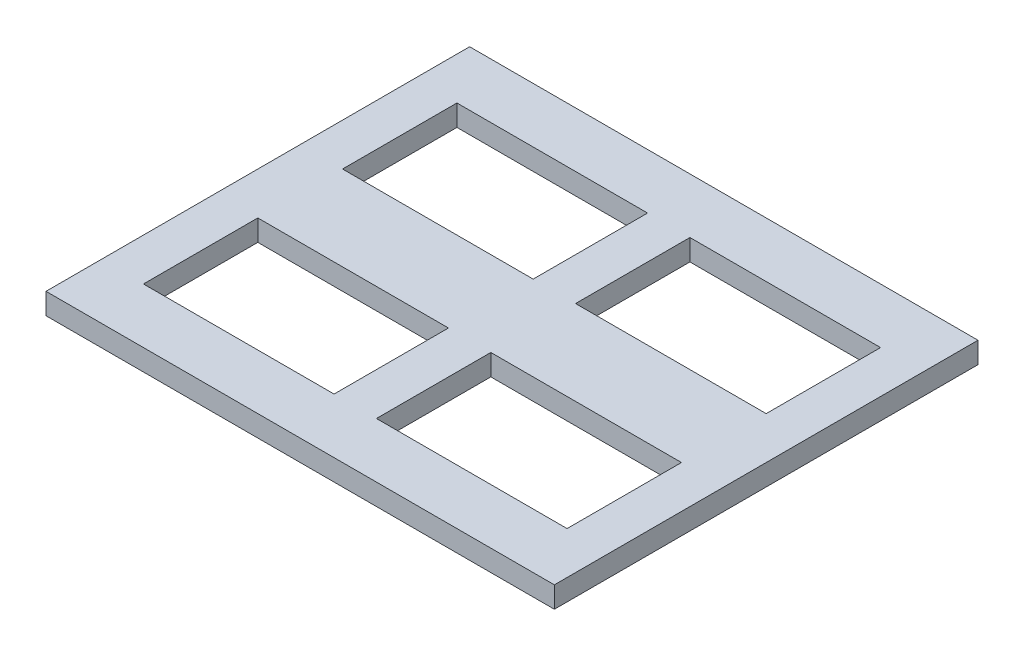
ISO-10303-21;
HEADER;
FILE_DESCRIPTION(('STEP AP214'),'2;1');
FILE_NAME('part.step','',(''),(''),'','','');
FILE_SCHEMA(('AUTOMOTIVE_DESIGN { 1 0 10303 214 1 1 1 1 }'));
ENDSEC;
DATA;
#1=APPLICATION_CONTEXT('core data for automotive mechanical design processes');
#2=APPLICATION_PROTOCOL_DEFINITION('international standard','automotive_design',2000,#1);
#3=PRODUCT_CONTEXT('',#1,'mechanical');
#4=PRODUCT('Part','Part','',(#3));
#5=PRODUCT_RELATED_PRODUCT_CATEGORY('part','',(#4));
#6=PRODUCT_DEFINITION_FORMATION('','',#4);
#7=PRODUCT_DEFINITION_CONTEXT('part definition',#1,'design');
#8=PRODUCT_DEFINITION('design','',#6,#7);
#9=PRODUCT_DEFINITION_SHAPE('','',#8);
#10=(LENGTH_UNIT() NAMED_UNIT(*) SI_UNIT(.MILLI.,.METRE.));
#11=(NAMED_UNIT(*) PLANE_ANGLE_UNIT() SI_UNIT($,.RADIAN.));
#12=(NAMED_UNIT(*) SI_UNIT($,.STERADIAN.) SOLID_ANGLE_UNIT());
#13=UNCERTAINTY_MEASURE_WITH_UNIT(LENGTH_MEASURE(1.E-05),#10,'distance_accuracy_value','');
#14=(GEOMETRIC_REPRESENTATION_CONTEXT(3) GLOBAL_UNCERTAINTY_ASSIGNED_CONTEXT((#13)) GLOBAL_UNIT_ASSIGNED_CONTEXT((#10,
#11,#12)) REPRESENTATION_CONTEXT('',''));
#15=CARTESIAN_POINT('',(0.,0.,0.));
#16=DIRECTION('',(0.,0.,1.));
#17=DIRECTION('',(1.,0.,0.));
#18=AXIS2_PLACEMENT_3D('',#15,#16,#17);
#19=CARTESIAN_POINT('',(0.,5.,0.));
#20=DIRECTION('',(0.,1.,0.));
#21=DIRECTION('',(0.,0.,1.));
#22=AXIS2_PLACEMENT_3D('',#19,#20,#21);
#23=PLANE('',#22);
#24=DIRECTION('',(0.,0.,1.));
#25=VECTOR('',#24,1.);
#26=CARTESIAN_POINT('',(-60.,5.,-50.));
#27=LINE('',#26,#25);
#28=CARTESIAN_POINT('',(-60.,5.,-50.));
#29=VERTEX_POINT('',#28);
#30=CARTESIAN_POINT('',(-60.,5.,50.));
#31=VERTEX_POINT('',#30);
#32=EDGE_CURVE('E299',#29,#31,#27,.T.);
#33=ORIENTED_EDGE('',*,*,#32,.T.);
#34=DIRECTION('',(1.,0.,0.));
#35=VECTOR('',#34,1.);
#36=CARTESIAN_POINT('',(-60.,5.,50.));
#37=LINE('',#36,#35);
#38=CARTESIAN_POINT('',(60.,5.,50.));
#39=VERTEX_POINT('',#38);
#40=EDGE_CURVE('E302',#31,#39,#37,.T.);
#41=ORIENTED_EDGE('',*,*,#40,.T.);
#42=DIRECTION('',(0.,0.,-1.));
#43=VECTOR('',#42,1.);
#44=CARTESIAN_POINT('',(60.,5.,-50.));
#45=LINE('',#44,#43);
#46=CARTESIAN_POINT('',(60.,5.,-50.));
#47=VERTEX_POINT('',#46);
#48=EDGE_CURVE('E305',#39,#47,#45,.T.);
#49=ORIENTED_EDGE('',*,*,#48,.T.);
#50=DIRECTION('',(-1.,0.,0.));
#51=VECTOR('',#50,1.);
#52=CARTESIAN_POINT('',(-60.,5.,-50.));
#53=LINE('',#52,#51);
#54=EDGE_CURVE('E307',#47,#29,#53,.T.);
#55=ORIENTED_EDGE('',*,*,#54,.T.);
#56=EDGE_LOOP('',(#33,#41,#49,#55));
#57=FACE_BOUND('',#56,.T.);
#58=DIRECTION('',(1.,0.,0.));
#59=VECTOR('',#58,1.);
#60=CARTESIAN_POINT('',(-50.,5.,-10.));
#61=LINE('',#60,#59);
#62=CARTESIAN_POINT('',(-50.,5.,-10.));
#63=VERTEX_POINT('',#62);
#64=CARTESIAN_POINT('',(-5.,5.,-10.));
#65=VERTEX_POINT('',#64);
#66=EDGE_CURVE('E270',#63,#65,#61,.T.);
#67=ORIENTED_EDGE('',*,*,#66,.F.);
#68=DIRECTION('',(0.,0.,1.));
#69=VECTOR('',#68,1.);
#70=CARTESIAN_POINT('',(-50.,5.,-37.));
#71=LINE('',#70,#69);
#72=CARTESIAN_POINT('',(-50.,5.,-37.));
#73=VERTEX_POINT('',#72);
#74=EDGE_CURVE('E268',#73,#63,#71,.T.);
#75=ORIENTED_EDGE('',*,*,#74,.F.);
#76=DIRECTION('',(-1.,0.,0.));
#77=VECTOR('',#76,1.);
#78=CARTESIAN_POINT('',(-50.,5.,-37.));
#79=LINE('',#78,#77);
#80=CARTESIAN_POINT('',(-5.,5.,-37.));
#81=VERTEX_POINT('',#80);
#82=EDGE_CURVE('E276',#81,#73,#79,.T.);
#83=ORIENTED_EDGE('',*,*,#82,.F.);
#84=DIRECTION('',(0.,0.,-1.));
#85=VECTOR('',#84,1.);
#86=CARTESIAN_POINT('',(-5.,5.,-37.));
#87=LINE('',#86,#85);
#88=EDGE_CURVE('E273',#65,#81,#87,.T.);
#89=ORIENTED_EDGE('',*,*,#88,.F.);
#90=EDGE_LOOP('',(#67,#75,#83,#89));
#91=FACE_BOUND('',#90,.T.);
#92=DIRECTION('',(1.,0.,0.));
#93=VECTOR('',#92,1.);
#94=CARTESIAN_POINT('',(-50.,5.,37.));
#95=LINE('',#94,#93);
#96=CARTESIAN_POINT('',(-50.,5.,37.));
#97=VERTEX_POINT('',#96);
#98=CARTESIAN_POINT('',(-4.99999999999998,5.,37.));
#99=VERTEX_POINT('',#98);
#100=EDGE_CURVE('E239',#97,#99,#95,.T.);
#101=ORIENTED_EDGE('',*,*,#100,.F.);
#102=DIRECTION('',(0.,0.,1.));
#103=VECTOR('',#102,1.);
#104=CARTESIAN_POINT('',(-50.,5.,37.));
#105=LINE('',#104,#103);
#106=CARTESIAN_POINT('',(-50.,5.,10.));
#107=VERTEX_POINT('',#106);
#108=EDGE_CURVE('E237',#107,#97,#105,.T.);
#109=ORIENTED_EDGE('',*,*,#108,.F.);
#110=DIRECTION('',(-1.,0.,0.));
#111=VECTOR('',#110,1.);
#112=CARTESIAN_POINT('',(-50.,5.,10.));
#113=LINE('',#112,#111);
#114=CARTESIAN_POINT('',(-5.,5.,10.));
#115=VERTEX_POINT('',#114);
#116=EDGE_CURVE('E245',#115,#107,#113,.T.);
#117=ORIENTED_EDGE('',*,*,#116,.F.);
#118=DIRECTION('',(0.,0.,-1.));
#119=VECTOR('',#118,1.);
#120=CARTESIAN_POINT('',(-4.99999999999998,5.,37.));
#121=LINE('',#120,#119);
#122=EDGE_CURVE('E242',#99,#115,#121,.T.);
#123=ORIENTED_EDGE('',*,*,#122,.F.);
#124=EDGE_LOOP('',(#101,#109,#117,#123));
#125=FACE_BOUND('',#124,.T.);
#126=DIRECTION('',(-1.,0.,0.));
#127=VECTOR('',#126,1.);
#128=CARTESIAN_POINT('',(50.,5.,-37.));
#129=LINE('',#128,#127);
#130=CARTESIAN_POINT('',(50.,5.,-37.));
#131=VERTEX_POINT('',#130);
#132=CARTESIAN_POINT('',(5.00000000000001,5.,-37.));
#133=VERTEX_POINT('',#132);
#134=EDGE_CURVE('E208',#131,#133,#129,.T.);
#135=ORIENTED_EDGE('',*,*,#134,.F.);
#136=DIRECTION('',(0.,0.,-1.));
#137=VECTOR('',#136,1.);
#138=CARTESIAN_POINT('',(50.,5.,-37.));
#139=LINE('',#138,#137);
#140=CARTESIAN_POINT('',(50.,5.,-10.));
#141=VERTEX_POINT('',#140);
#142=EDGE_CURVE('E206',#141,#131,#139,.T.);
#143=ORIENTED_EDGE('',*,*,#142,.F.);
#144=DIRECTION('',(1.,0.,0.));
#145=VECTOR('',#144,1.);
#146=CARTESIAN_POINT('',(50.,5.,-10.));
#147=LINE('',#146,#145);
#148=CARTESIAN_POINT('',(5.,5.,-10.));
#149=VERTEX_POINT('',#148);
#150=EDGE_CURVE('E214',#149,#141,#147,.T.);
#151=ORIENTED_EDGE('',*,*,#150,.F.);
#152=DIRECTION('',(0.,0.,1.));
#153=VECTOR('',#152,1.);
#154=CARTESIAN_POINT('',(5.00000000000001,5.,-37.));
#155=LINE('',#154,#153);
#156=EDGE_CURVE('E211',#133,#149,#155,.T.);
#157=ORIENTED_EDGE('',*,*,#156,.F.);
#158=EDGE_LOOP('',(#135,#143,#151,#157));
#159=FACE_BOUND('',#158,.T.);
#160=DIRECTION('',(-1.,0.,0.));
#161=VECTOR('',#160,1.);
#162=CARTESIAN_POINT('',(50.,5.,10.));
#163=LINE('',#162,#161);
#164=CARTESIAN_POINT('',(50.,5.,10.));
#165=VERTEX_POINT('',#164);
#166=CARTESIAN_POINT('',(5.,5.,10.));
#167=VERTEX_POINT('',#166);
#168=EDGE_CURVE('E178',#165,#167,#163,.T.);
#169=ORIENTED_EDGE('',*,*,#168,.F.);
#170=DIRECTION('',(0.,0.,-1.));
#171=VECTOR('',#170,1.);
#172=CARTESIAN_POINT('',(50.,5.,37.));
#173=LINE('',#172,#171);
#174=CARTESIAN_POINT('',(50.,5.,37.));
#175=VERTEX_POINT('',#174);
#176=EDGE_CURVE('E170',#175,#165,#173,.T.);
#177=ORIENTED_EDGE('',*,*,#176,.F.);
#178=DIRECTION('',(1.,0.,0.));
#179=VECTOR('',#178,1.);
#180=CARTESIAN_POINT('',(50.,5.,37.));
#181=LINE('',#180,#179);
#182=CARTESIAN_POINT('',(5.00000000000001,5.,37.));
#183=VERTEX_POINT('',#182);
#184=EDGE_CURVE('E192',#183,#175,#181,.T.);
#185=ORIENTED_EDGE('',*,*,#184,.F.);
#186=DIRECTION('',(0.,0.,1.));
#187=VECTOR('',#186,1.);
#188=CARTESIAN_POINT('',(5.00000000000001,5.,37.));
#189=LINE('',#188,#187);
#190=EDGE_CURVE('E190',#167,#183,#189,.T.);
#191=ORIENTED_EDGE('',*,*,#190,.F.);
#192=EDGE_LOOP('',(#169,#177,#185,#191));
#193=FACE_BOUND('',#192,.T.);
#194=ADVANCED_FACE('F33',(#57,#91,#125,#159,#193),#23,.T.);
#195=CARTESIAN_POINT('',(0.,0.,0.));
#196=DIRECTION('',(0.,1.,0.));
#197=DIRECTION('',(0.,0.,1.));
#198=AXIS2_PLACEMENT_3D('',#195,#196,#197);
#199=PLANE('',#198);
#200=DIRECTION('',(0.,0.,-1.));
#201=VECTOR('',#200,1.);
#202=CARTESIAN_POINT('',(50.,0.,-37.));
#203=LINE('',#202,#201);
#204=CARTESIAN_POINT('',(50.,0.,-10.));
#205=VERTEX_POINT('',#204);
#206=CARTESIAN_POINT('',(50.,0.,-37.));
#207=VERTEX_POINT('',#206);
#208=EDGE_CURVE('E186',#205,#207,#203,.T.);
#209=ORIENTED_EDGE('',*,*,#208,.T.);
#210=DIRECTION('',(-1.,0.,0.));
#211=VECTOR('',#210,1.);
#212=CARTESIAN_POINT('',(50.,0.,-37.));
#213=LINE('',#212,#211);
#214=CARTESIAN_POINT('',(5.00000000000001,0.,-37.));
#215=VERTEX_POINT('',#214);
#216=EDGE_CURVE('E219',#207,#215,#213,.T.);
#217=ORIENTED_EDGE('',*,*,#216,.T.);
#218=DIRECTION('',(0.,0.,1.));
#219=VECTOR('',#218,1.);
#220=CARTESIAN_POINT('',(5.00000000000001,0.,-37.));
#221=LINE('',#220,#219);
#222=CARTESIAN_POINT('',(5.,0.,-10.));
#223=VERTEX_POINT('',#222);
#224=EDGE_CURVE('E222',#215,#223,#221,.T.);
#225=ORIENTED_EDGE('',*,*,#224,.T.);
#226=DIRECTION('',(1.,0.,0.));
#227=VECTOR('',#226,1.);
#228=CARTESIAN_POINT('',(50.,0.,-10.));
#229=LINE('',#228,#227);
#230=EDGE_CURVE('E209',#223,#205,#229,.T.);
#231=ORIENTED_EDGE('',*,*,#230,.T.);
#232=EDGE_LOOP('',(#209,#217,#225,#231));
#233=FACE_BOUND('',#232,.T.);
#234=DIRECTION('',(0.,0.,1.));
#235=VECTOR('',#234,1.);
#236=CARTESIAN_POINT('',(-50.,0.,-37.));
#237=LINE('',#236,#235);
#238=CARTESIAN_POINT('',(-50.,0.,-37.));
#239=VERTEX_POINT('',#238);
#240=CARTESIAN_POINT('',(-50.,0.,-10.));
#241=VERTEX_POINT('',#240);
#242=EDGE_CURVE('E267',#239,#241,#237,.T.);
#243=ORIENTED_EDGE('',*,*,#242,.T.);
#244=DIRECTION('',(1.,0.,0.));
#245=VECTOR('',#244,1.);
#246=CARTESIAN_POINT('',(-50.,0.,-10.));
#247=LINE('',#246,#245);
#248=CARTESIAN_POINT('',(-5.,0.,-10.));
#249=VERTEX_POINT('',#248);
#250=EDGE_CURVE('E281',#241,#249,#247,.T.);
#251=ORIENTED_EDGE('',*,*,#250,.T.);
#252=DIRECTION('',(0.,0.,-1.));
#253=VECTOR('',#252,1.);
#254=CARTESIAN_POINT('',(-5.,0.,-37.));
#255=LINE('',#254,#253);
#256=CARTESIAN_POINT('',(-5.,0.,-37.));
#257=VERTEX_POINT('',#256);
#258=EDGE_CURVE('E284',#249,#257,#255,.T.);
#259=ORIENTED_EDGE('',*,*,#258,.T.);
#260=DIRECTION('',(-1.,0.,0.));
#261=VECTOR('',#260,1.);
#262=CARTESIAN_POINT('',(-50.,0.,-37.));
#263=LINE('',#262,#261);
#264=EDGE_CURVE('E271',#257,#239,#263,.T.);
#265=ORIENTED_EDGE('',*,*,#264,.T.);
#266=EDGE_LOOP('',(#243,#251,#259,#265));
#267=FACE_BOUND('',#266,.T.);
#268=DIRECTION('',(0.,0.,1.));
#269=VECTOR('',#268,1.);
#270=CARTESIAN_POINT('',(-60.,0.,-50.));
#271=LINE('',#270,#269);
#272=CARTESIAN_POINT('',(-60.,0.,-50.));
#273=VERTEX_POINT('',#272);
#274=CARTESIAN_POINT('',(-60.,0.,50.));
#275=VERTEX_POINT('',#274);
#276=EDGE_CURVE('E298',#273,#275,#271,.T.);
#277=ORIENTED_EDGE('',*,*,#276,.F.);
#278=DIRECTION('',(-1.,0.,0.));
#279=VECTOR('',#278,1.);
#280=CARTESIAN_POINT('',(-60.,0.,-50.));
#281=LINE('',#280,#279);
#282=CARTESIAN_POINT('',(60.,0.,-50.));
#283=VERTEX_POINT('',#282);
#284=EDGE_CURVE('E303',#283,#273,#281,.T.);
#285=ORIENTED_EDGE('',*,*,#284,.F.);
#286=DIRECTION('',(0.,0.,-1.));
#287=VECTOR('',#286,1.);
#288=CARTESIAN_POINT('',(60.,0.,-50.));
#289=LINE('',#288,#287);
#290=CARTESIAN_POINT('',(60.,0.,50.));
#291=VERTEX_POINT('',#290);
#292=EDGE_CURVE('E314',#291,#283,#289,.T.);
#293=ORIENTED_EDGE('',*,*,#292,.F.);
#294=DIRECTION('',(1.,0.,0.));
#295=VECTOR('',#294,1.);
#296=CARTESIAN_POINT('',(-60.,0.,50.));
#297=LINE('',#296,#295);
#298=EDGE_CURVE('E312',#275,#291,#297,.T.);
#299=ORIENTED_EDGE('',*,*,#298,.F.);
#300=EDGE_LOOP('',(#277,#285,#293,#299));
#301=FACE_BOUND('',#300,.T.);
#302=DIRECTION('',(0.,0.,1.));
#303=VECTOR('',#302,1.);
#304=CARTESIAN_POINT('',(-50.,0.,37.));
#305=LINE('',#304,#303);
#306=CARTESIAN_POINT('',(-50.,0.,10.));
#307=VERTEX_POINT('',#306);
#308=CARTESIAN_POINT('',(-50.,0.,37.));
#309=VERTEX_POINT('',#308);
#310=EDGE_CURVE('E236',#307,#309,#305,.T.);
#311=ORIENTED_EDGE('',*,*,#310,.T.);
#312=DIRECTION('',(1.,0.,0.));
#313=VECTOR('',#312,1.);
#314=CARTESIAN_POINT('',(-50.,0.,37.));
#315=LINE('',#314,#313);
#316=CARTESIAN_POINT('',(-4.99999999999998,0.,37.));
#317=VERTEX_POINT('',#316);
#318=EDGE_CURVE('E250',#309,#317,#315,.T.);
#319=ORIENTED_EDGE('',*,*,#318,.T.);
#320=DIRECTION('',(0.,0.,-1.));
#321=VECTOR('',#320,1.);
#322=CARTESIAN_POINT('',(-4.99999999999998,0.,37.));
#323=LINE('',#322,#321);
#324=CARTESIAN_POINT('',(-5.,0.,10.));
#325=VERTEX_POINT('',#324);
#326=EDGE_CURVE('E253',#317,#325,#323,.T.);
#327=ORIENTED_EDGE('',*,*,#326,.T.);
#328=DIRECTION('',(-1.,0.,0.));
#329=VECTOR('',#328,1.);
#330=CARTESIAN_POINT('',(-50.,0.,10.));
#331=LINE('',#330,#329);
#332=EDGE_CURVE('E240',#325,#307,#331,.T.);
#333=ORIENTED_EDGE('',*,*,#332,.T.);
#334=EDGE_LOOP('',(#311,#319,#327,#333));
#335=FACE_BOUND('',#334,.T.);
#336=DIRECTION('',(0.,0.,-1.));
#337=VECTOR('',#336,1.);
#338=CARTESIAN_POINT('',(50.,0.,37.));
#339=LINE('',#338,#337);
#340=CARTESIAN_POINT('',(50.,0.,37.));
#341=VERTEX_POINT('',#340);
#342=CARTESIAN_POINT('',(50.,0.,10.));
#343=VERTEX_POINT('',#342);
#344=EDGE_CURVE('E56',#341,#343,#339,.T.);
#345=ORIENTED_EDGE('',*,*,#344,.T.);
#346=DIRECTION('',(-1.,0.,0.));
#347=VECTOR('',#346,1.);
#348=CARTESIAN_POINT('',(50.,0.,10.));
#349=LINE('',#348,#347);
#350=CARTESIAN_POINT('',(5.,0.,10.));
#351=VERTEX_POINT('',#350);
#352=EDGE_CURVE('E185',#343,#351,#349,.T.);
#353=ORIENTED_EDGE('',*,*,#352,.T.);
#354=DIRECTION('',(0.,0.,1.));
#355=VECTOR('',#354,1.);
#356=CARTESIAN_POINT('',(5.00000000000001,0.,37.));
#357=LINE('',#356,#355);
#358=CARTESIAN_POINT('',(5.00000000000001,0.,37.));
#359=VERTEX_POINT('',#358);
#360=EDGE_CURVE('E198',#351,#359,#357,.T.);
#361=ORIENTED_EDGE('',*,*,#360,.T.);
#362=DIRECTION('',(1.,0.,0.));
#363=VECTOR('',#362,1.);
#364=CARTESIAN_POINT('',(50.,0.,37.));
#365=LINE('',#364,#363);
#366=EDGE_CURVE('E179',#359,#341,#365,.T.);
#367=ORIENTED_EDGE('',*,*,#366,.T.);
#368=EDGE_LOOP('',(#345,#353,#361,#367));
#369=FACE_BOUND('',#368,.T.);
#370=ADVANCED_FACE('F332',(#233,#267,#301,#335,#369),#199,.F.);
#371=CARTESIAN_POINT('',(-60.,5.,-50.));
#372=DIRECTION('',(1.,0.,0.));
#373=DIRECTION('',(0.,0.,-1.));
#374=AXIS2_PLACEMENT_3D('',#371,#372,#373);
#375=PLANE('',#374);
#376=ORIENTED_EDGE('',*,*,#276,.T.);
#377=DIRECTION('',(0.,-1.,0.));
#378=VECTOR('',#377,1.);
#379=CARTESIAN_POINT('',(-60.,5.,50.));
#380=LINE('',#379,#378);
#381=EDGE_CURVE('E11',#31,#275,#380,.T.);
#382=ORIENTED_EDGE('',*,*,#381,.F.);
#383=ORIENTED_EDGE('',*,*,#32,.F.);
#384=DIRECTION('',(0.,-1.,0.));
#385=VECTOR('',#384,1.);
#386=CARTESIAN_POINT('',(-60.,5.,-50.));
#387=LINE('',#386,#385);
#388=EDGE_CURVE('E309',#29,#273,#387,.T.);
#389=ORIENTED_EDGE('',*,*,#388,.T.);
#390=EDGE_LOOP('',(#376,#382,#383,#389));
#391=FACE_BOUND('',#390,.T.);
#392=ADVANCED_FACE('F35',(#391),#375,.F.);
#393=CARTESIAN_POINT('',(-60.,5.,50.));
#394=DIRECTION('',(0.,0.,-1.));
#395=DIRECTION('',(-1.,0.,0.));
#396=AXIS2_PLACEMENT_3D('',#393,#394,#395);
#397=PLANE('',#396);
#398=ORIENTED_EDGE('',*,*,#298,.T.);
#399=DIRECTION('',(0.,-1.,0.));
#400=VECTOR('',#399,1.);
#401=CARTESIAN_POINT('',(60.,5.,50.));
#402=LINE('',#401,#400);
#403=EDGE_CURVE('E41',#39,#291,#402,.T.);
#404=ORIENTED_EDGE('',*,*,#403,.F.);
#405=ORIENTED_EDGE('',*,*,#40,.F.);
#406=ORIENTED_EDGE('',*,*,#381,.T.);
#407=EDGE_LOOP('',(#398,#404,#405,#406));
#408=FACE_BOUND('',#407,.T.);
#409=ADVANCED_FACE('F343',(#408),#397,.F.);
#410=CARTESIAN_POINT('',(60.,5.,-50.));
#411=DIRECTION('',(-1.,0.,0.));
#412=DIRECTION('',(0.,0.,1.));
#413=AXIS2_PLACEMENT_3D('',#410,#411,#412);
#414=PLANE('',#413);
#415=ORIENTED_EDGE('',*,*,#292,.T.);
#416=DIRECTION('',(0.,-1.,0.));
#417=VECTOR('',#416,1.);
#418=CARTESIAN_POINT('',(60.,5.,-50.));
#419=LINE('',#418,#417);
#420=EDGE_CURVE('E319',#47,#283,#419,.T.);
#421=ORIENTED_EDGE('',*,*,#420,.F.);
#422=ORIENTED_EDGE('',*,*,#48,.F.);
#423=ORIENTED_EDGE('',*,*,#403,.T.);
#424=EDGE_LOOP('',(#415,#421,#422,#423));
#425=FACE_BOUND('',#424,.T.);
#426=ADVANCED_FACE('F326',(#425),#414,.F.);
#427=CARTESIAN_POINT('',(-60.,5.,-50.));
#428=DIRECTION('',(0.,0.,1.));
#429=DIRECTION('',(1.,0.,0.));
#430=AXIS2_PLACEMENT_3D('',#427,#428,#429);
#431=PLANE('',#430);
#432=ORIENTED_EDGE('',*,*,#284,.T.);
#433=ORIENTED_EDGE('',*,*,#388,.F.);
#434=ORIENTED_EDGE('',*,*,#54,.F.);
#435=ORIENTED_EDGE('',*,*,#420,.T.);
#436=EDGE_LOOP('',(#432,#433,#434,#435));
#437=FACE_BOUND('',#436,.T.);
#438=ADVANCED_FACE('F336',(#437),#431,.F.);
#439=CARTESIAN_POINT('',(-50.,5.,-37.));
#440=DIRECTION('',(1.,0.,0.));
#441=DIRECTION('',(0.,0.,-1.));
#442=AXIS2_PLACEMENT_3D('',#439,#440,#441);
#443=PLANE('',#442);
#444=ORIENTED_EDGE('',*,*,#242,.F.);
#445=DIRECTION('',(0.,-1.,0.));
#446=VECTOR('',#445,1.);
#447=CARTESIAN_POINT('',(-50.,5.,-37.));
#448=LINE('',#447,#446);
#449=EDGE_CURVE('E278',#73,#239,#448,.T.);
#450=ORIENTED_EDGE('',*,*,#449,.F.);
#451=ORIENTED_EDGE('',*,*,#74,.T.);
#452=DIRECTION('',(0.,-1.,0.));
#453=VECTOR('',#452,1.);
#454=CARTESIAN_POINT('',(-50.,5.,-10.));
#455=LINE('',#454,#453);
#456=EDGE_CURVE('E295',#63,#241,#455,.T.);
#457=ORIENTED_EDGE('',*,*,#456,.T.);
#458=EDGE_LOOP('',(#444,#450,#451,#457));
#459=FACE_BOUND('',#458,.T.);
#460=ADVANCED_FACE('F358',(#459),#443,.T.);
#461=CARTESIAN_POINT('',(-50.,5.,-10.));
#462=DIRECTION('',(0.,0.,-1.));
#463=DIRECTION('',(-1.,0.,0.));
#464=AXIS2_PLACEMENT_3D('',#461,#462,#463);
#465=PLANE('',#464);
#466=ORIENTED_EDGE('',*,*,#250,.F.);
#467=ORIENTED_EDGE('',*,*,#456,.F.);
#468=ORIENTED_EDGE('',*,*,#66,.T.);
#469=DIRECTION('',(0.,-1.,0.));
#470=VECTOR('',#469,1.);
#471=CARTESIAN_POINT('',(-5.,5.,-10.));
#472=LINE('',#471,#470);
#473=EDGE_CURVE('E293',#65,#249,#472,.T.);
#474=ORIENTED_EDGE('',*,*,#473,.T.);
#475=EDGE_LOOP('',(#466,#467,#468,#474));
#476=FACE_BOUND('',#475,.T.);
#477=ADVANCED_FACE('F365',(#476),#465,.T.);
#478=CARTESIAN_POINT('',(-5.,5.,-37.));
#479=DIRECTION('',(-1.,0.,0.));
#480=DIRECTION('',(0.,0.,1.));
#481=AXIS2_PLACEMENT_3D('',#478,#479,#480);
#482=PLANE('',#481);
#483=ORIENTED_EDGE('',*,*,#258,.F.);
#484=ORIENTED_EDGE('',*,*,#473,.F.);
#485=ORIENTED_EDGE('',*,*,#88,.T.);
#486=DIRECTION('',(0.,-1.,0.));
#487=VECTOR('',#486,1.);
#488=CARTESIAN_POINT('',(-5.,5.,-37.));
#489=LINE('',#488,#487);
#490=EDGE_CURVE('E291',#81,#257,#489,.T.);
#491=ORIENTED_EDGE('',*,*,#490,.T.);
#492=EDGE_LOOP('',(#483,#484,#485,#491));
#493=FACE_BOUND('',#492,.T.);
#494=ADVANCED_FACE('F370',(#493),#482,.T.);
#495=CARTESIAN_POINT('',(-50.,5.,-37.));
#496=DIRECTION('',(0.,0.,1.));
#497=DIRECTION('',(1.,0.,0.));
#498=AXIS2_PLACEMENT_3D('',#495,#496,#497);
#499=PLANE('',#498);
#500=ORIENTED_EDGE('',*,*,#264,.F.);
#501=ORIENTED_EDGE('',*,*,#490,.F.);
#502=ORIENTED_EDGE('',*,*,#82,.T.);
#503=ORIENTED_EDGE('',*,*,#449,.T.);
#504=EDGE_LOOP('',(#500,#501,#502,#503));
#505=FACE_BOUND('',#504,.T.);
#506=ADVANCED_FACE('F378',(#505),#499,.T.);
#507=CARTESIAN_POINT('',(-50.,5.,37.));
#508=DIRECTION('',(1.,0.,0.));
#509=DIRECTION('',(0.,0.,-1.));
#510=AXIS2_PLACEMENT_3D('',#507,#508,#509);
#511=PLANE('',#510);
#512=ORIENTED_EDGE('',*,*,#310,.F.);
#513=DIRECTION('',(0.,-1.,0.));
#514=VECTOR('',#513,1.);
#515=CARTESIAN_POINT('',(-50.,5.,10.));
#516=LINE('',#515,#514);
#517=EDGE_CURVE('E247',#107,#307,#516,.T.);
#518=ORIENTED_EDGE('',*,*,#517,.F.);
#519=ORIENTED_EDGE('',*,*,#108,.T.);
#520=DIRECTION('',(0.,-1.,0.));
#521=VECTOR('',#520,1.);
#522=CARTESIAN_POINT('',(-50.,5.,37.));
#523=LINE('',#522,#521);
#524=EDGE_CURVE('E264',#97,#309,#523,.T.);
#525=ORIENTED_EDGE('',*,*,#524,.T.);
#526=EDGE_LOOP('',(#512,#518,#519,#525));
#527=FACE_BOUND('',#526,.T.);
#528=ADVANCED_FACE('F432',(#527),#511,.T.);
#529=CARTESIAN_POINT('',(-50.,5.,37.));
#530=DIRECTION('',(0.,0.,-1.));
#531=DIRECTION('',(-1.,0.,0.));
#532=AXIS2_PLACEMENT_3D('',#529,#530,#531);
#533=PLANE('',#532);
#534=ORIENTED_EDGE('',*,*,#318,.F.);
#535=ORIENTED_EDGE('',*,*,#524,.F.);
#536=ORIENTED_EDGE('',*,*,#100,.T.);
#537=DIRECTION('',(0.,-1.,0.));
#538=VECTOR('',#537,1.);
#539=CARTESIAN_POINT('',(-4.99999999999998,5.,37.));
#540=LINE('',#539,#538);
#541=EDGE_CURVE('E262',#99,#317,#540,.T.);
#542=ORIENTED_EDGE('',*,*,#541,.T.);
#543=EDGE_LOOP('',(#534,#535,#536,#542));
#544=FACE_BOUND('',#543,.T.);
#545=ADVANCED_FACE('F428',(#544),#533,.T.);
#546=CARTESIAN_POINT('',(-4.99999999999998,5.,37.));
#547=DIRECTION('',(-1.,0.,0.));
#548=DIRECTION('',(0.,0.,1.));
#549=AXIS2_PLACEMENT_3D('',#546,#547,#548);
#550=PLANE('',#549);
#551=ORIENTED_EDGE('',*,*,#326,.F.);
#552=ORIENTED_EDGE('',*,*,#541,.F.);
#553=ORIENTED_EDGE('',*,*,#122,.T.);
#554=DIRECTION('',(0.,-1.,0.));
#555=VECTOR('',#554,1.);
#556=CARTESIAN_POINT('',(-5.,5.,10.));
#557=LINE('',#556,#555);
#558=EDGE_CURVE('E260',#115,#325,#557,.T.);
#559=ORIENTED_EDGE('',*,*,#558,.T.);
#560=EDGE_LOOP('',(#551,#552,#553,#559));
#561=FACE_BOUND('',#560,.T.);
#562=ADVANCED_FACE('F424',(#561),#550,.T.);
#563=CARTESIAN_POINT('',(-50.,5.,10.));
#564=DIRECTION('',(0.,0.,1.));
#565=DIRECTION('',(1.,0.,0.));
#566=AXIS2_PLACEMENT_3D('',#563,#564,#565);
#567=PLANE('',#566);
#568=ORIENTED_EDGE('',*,*,#332,.F.);
#569=ORIENTED_EDGE('',*,*,#558,.F.);
#570=ORIENTED_EDGE('',*,*,#116,.T.);
#571=ORIENTED_EDGE('',*,*,#517,.T.);
#572=EDGE_LOOP('',(#568,#569,#570,#571));
#573=FACE_BOUND('',#572,.T.);
#574=ADVANCED_FACE('F421',(#573),#567,.T.);
#575=CARTESIAN_POINT('',(50.,5.,-37.));
#576=DIRECTION('',(-1.,0.,0.));
#577=DIRECTION('',(0.,0.,1.));
#578=AXIS2_PLACEMENT_3D('',#575,#576,#577);
#579=PLANE('',#578);
#580=ORIENTED_EDGE('',*,*,#208,.F.);
#581=DIRECTION('',(0.,-1.,0.));
#582=VECTOR('',#581,1.);
#583=CARTESIAN_POINT('',(50.,5.,-10.));
#584=LINE('',#583,#582);
#585=EDGE_CURVE('E216',#141,#205,#584,.T.);
#586=ORIENTED_EDGE('',*,*,#585,.F.);
#587=ORIENTED_EDGE('',*,*,#142,.T.);
#588=DIRECTION('',(0.,-1.,0.));
#589=VECTOR('',#588,1.);
#590=CARTESIAN_POINT('',(50.,5.,-37.));
#591=LINE('',#590,#589);
#592=EDGE_CURVE('E233',#131,#207,#591,.T.);
#593=ORIENTED_EDGE('',*,*,#592,.T.);
#594=EDGE_LOOP('',(#580,#586,#587,#593));
#595=FACE_BOUND('',#594,.T.);
#596=ADVANCED_FACE('F403',(#595),#579,.T.);
#597=CARTESIAN_POINT('',(50.,5.,-37.));
#598=DIRECTION('',(0.,0.,1.));
#599=DIRECTION('',(1.,0.,0.));
#600=AXIS2_PLACEMENT_3D('',#597,#598,#599);
#601=PLANE('',#600);
#602=ORIENTED_EDGE('',*,*,#216,.F.);
#603=ORIENTED_EDGE('',*,*,#592,.F.);
#604=ORIENTED_EDGE('',*,*,#134,.T.);
#605=DIRECTION('',(0.,-1.,0.));
#606=VECTOR('',#605,1.);
#607=CARTESIAN_POINT('',(5.00000000000001,5.,-37.));
#608=LINE('',#607,#606);
#609=EDGE_CURVE('E231',#133,#215,#608,.T.);
#610=ORIENTED_EDGE('',*,*,#609,.T.);
#611=EDGE_LOOP('',(#602,#603,#604,#610));
#612=FACE_BOUND('',#611,.T.);
#613=ADVANCED_FACE('F397',(#612),#601,.T.);
#614=CARTESIAN_POINT('',(5.00000000000001,5.,-37.));
#615=DIRECTION('',(1.,0.,0.));
#616=DIRECTION('',(0.,0.,-1.));
#617=AXIS2_PLACEMENT_3D('',#614,#615,#616);
#618=PLANE('',#617);
#619=ORIENTED_EDGE('',*,*,#224,.F.);
#620=ORIENTED_EDGE('',*,*,#609,.F.);
#621=ORIENTED_EDGE('',*,*,#156,.T.);
#622=DIRECTION('',(0.,-1.,0.));
#623=VECTOR('',#622,1.);
#624=CARTESIAN_POINT('',(5.,5.,-10.));
#625=LINE('',#624,#623);
#626=EDGE_CURVE('E229',#149,#223,#625,.T.);
#627=ORIENTED_EDGE('',*,*,#626,.T.);
#628=EDGE_LOOP('',(#619,#620,#621,#627));
#629=FACE_BOUND('',#628,.T.);
#630=ADVANCED_FACE('F400',(#629),#618,.T.);
#631=CARTESIAN_POINT('',(50.,5.,-10.));
#632=DIRECTION('',(0.,0.,-1.));
#633=DIRECTION('',(-1.,0.,0.));
#634=AXIS2_PLACEMENT_3D('',#631,#632,#633);
#635=PLANE('',#634);
#636=ORIENTED_EDGE('',*,*,#230,.F.);
#637=ORIENTED_EDGE('',*,*,#626,.F.);
#638=ORIENTED_EDGE('',*,*,#150,.T.);
#639=ORIENTED_EDGE('',*,*,#585,.T.);
#640=EDGE_LOOP('',(#636,#637,#638,#639));
#641=FACE_BOUND('',#640,.T.);
#642=ADVANCED_FACE('F406',(#641),#635,.T.);
#643=CARTESIAN_POINT('',(50.,5.,37.));
#644=DIRECTION('',(-1.,0.,0.));
#645=DIRECTION('',(0.,0.,1.));
#646=AXIS2_PLACEMENT_3D('',#643,#644,#645);
#647=PLANE('',#646);
#648=ORIENTED_EDGE('',*,*,#344,.F.);
#649=DIRECTION('',(0.,-1.,0.));
#650=VECTOR('',#649,1.);
#651=CARTESIAN_POINT('',(50.,5.,37.));
#652=LINE('',#651,#650);
#653=EDGE_CURVE('E174',#175,#341,#652,.T.);
#654=ORIENTED_EDGE('',*,*,#653,.F.);
#655=ORIENTED_EDGE('',*,*,#176,.T.);
#656=DIRECTION('',(0.,-1.,0.));
#657=VECTOR('',#656,1.);
#658=CARTESIAN_POINT('',(50.,5.,10.));
#659=LINE('',#658,#657);
#660=EDGE_CURVE('E173',#165,#343,#659,.T.);
#661=ORIENTED_EDGE('',*,*,#660,.T.);
#662=EDGE_LOOP('',(#648,#654,#655,#661));
#663=FACE_BOUND('',#662,.T.);
#664=ADVANCED_FACE('F172',(#663),#647,.T.);
#665=CARTESIAN_POINT('',(50.,5.,10.));
#666=DIRECTION('',(0.,0.,1.));
#667=DIRECTION('',(1.,0.,0.));
#668=AXIS2_PLACEMENT_3D('',#665,#666,#667);
#669=PLANE('',#668);
#670=ORIENTED_EDGE('',*,*,#352,.F.);
#671=ORIENTED_EDGE('',*,*,#660,.F.);
#672=ORIENTED_EDGE('',*,*,#168,.T.);
#673=DIRECTION('',(0.,-1.,0.));
#674=VECTOR('',#673,1.);
#675=CARTESIAN_POINT('',(5.,5.,10.));
#676=LINE('',#675,#674);
#677=EDGE_CURVE('E187',#167,#351,#676,.T.);
#678=ORIENTED_EDGE('',*,*,#677,.T.);
#679=EDGE_LOOP('',(#670,#671,#672,#678));
#680=FACE_BOUND('',#679,.T.);
#681=ADVANCED_FACE('F182',(#680),#669,.T.);
#682=CARTESIAN_POINT('',(5.00000000000001,5.,37.));
#683=DIRECTION('',(1.,0.,0.));
#684=DIRECTION('',(0.,0.,-1.));
#685=AXIS2_PLACEMENT_3D('',#682,#683,#684);
#686=PLANE('',#685);
#687=ORIENTED_EDGE('',*,*,#360,.F.);
#688=ORIENTED_EDGE('',*,*,#677,.F.);
#689=ORIENTED_EDGE('',*,*,#190,.T.);
#690=DIRECTION('',(0.,-1.,0.));
#691=VECTOR('',#690,1.);
#692=CARTESIAN_POINT('',(5.00000000000001,5.,37.));
#693=LINE('',#692,#691);
#694=EDGE_CURVE('E48',#183,#359,#693,.T.);
#695=ORIENTED_EDGE('',*,*,#694,.T.);
#696=EDGE_LOOP('',(#687,#688,#689,#695));
#697=FACE_BOUND('',#696,.T.);
#698=ADVANCED_FACE('F495',(#697),#686,.T.);
#699=CARTESIAN_POINT('',(50.,5.,37.));
#700=DIRECTION('',(0.,0.,-1.));
#701=DIRECTION('',(-1.,0.,0.));
#702=AXIS2_PLACEMENT_3D('',#699,#700,#701);
#703=PLANE('',#702);
#704=ORIENTED_EDGE('',*,*,#366,.F.);
#705=ORIENTED_EDGE('',*,*,#694,.F.);
#706=ORIENTED_EDGE('',*,*,#184,.T.);
#707=ORIENTED_EDGE('',*,*,#653,.T.);
#708=EDGE_LOOP('',(#704,#705,#706,#707));
#709=FACE_BOUND('',#708,.T.);
#710=ADVANCED_FACE('F503',(#709),#703,.T.);
#711=CLOSED_SHELL('',(#194,#370,#392,#409,#426,#438,#460,#477,#494,#506,#528,#545,#562,#574,
#596,#613,#630,#642,#664,#681,#698,#710));
#712=MANIFOLD_SOLID_BREP('B2',#711);
#713=ADVANCED_BREP_SHAPE_REPRESENTATION('',(#18,#712),#14);
#714=SHAPE_DEFINITION_REPRESENTATION(#9,#713);
ENDSEC;
END-ISO-10303-21;
